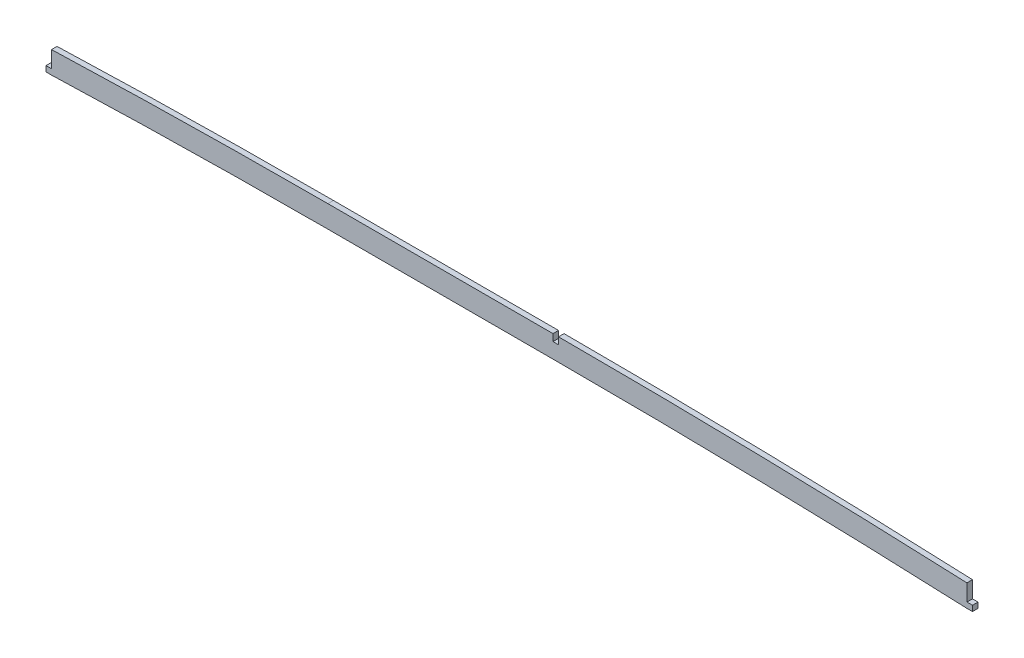
ISO-10303-21;
HEADER;
FILE_DESCRIPTION(('STEP AP214'),'2;1');
FILE_NAME('part.step','',(''),(''),'','','');
FILE_SCHEMA(('AUTOMOTIVE_DESIGN { 1 0 10303 214 1 1 1 1 }'));
ENDSEC;
DATA;
#1=APPLICATION_CONTEXT('core data for automotive mechanical design processes');
#2=APPLICATION_PROTOCOL_DEFINITION('international standard','automotive_design',2000,#1);
#3=PRODUCT_CONTEXT('',#1,'mechanical');
#4=PRODUCT('Part','Part','',(#3));
#5=PRODUCT_RELATED_PRODUCT_CATEGORY('part','',(#4));
#6=PRODUCT_DEFINITION_FORMATION('','',#4);
#7=PRODUCT_DEFINITION_CONTEXT('part definition',#1,'design');
#8=PRODUCT_DEFINITION('design','',#6,#7);
#9=PRODUCT_DEFINITION_SHAPE('','',#8);
#10=(LENGTH_UNIT() NAMED_UNIT(*) SI_UNIT(.MILLI.,.METRE.));
#11=(NAMED_UNIT(*) PLANE_ANGLE_UNIT() SI_UNIT($,.RADIAN.));
#12=(NAMED_UNIT(*) SI_UNIT($,.STERADIAN.) SOLID_ANGLE_UNIT());
#13=UNCERTAINTY_MEASURE_WITH_UNIT(LENGTH_MEASURE(1.E-05),#10,'distance_accuracy_value','');
#14=(GEOMETRIC_REPRESENTATION_CONTEXT(3) GLOBAL_UNCERTAINTY_ASSIGNED_CONTEXT((#13)) GLOBAL_UNIT_ASSIGNED_CONTEXT((#10,
#11,#12)) REPRESENTATION_CONTEXT('',''));
#15=CARTESIAN_POINT('',(0.,0.,0.));
#16=DIRECTION('',(0.,0.,1.));
#17=DIRECTION('',(1.,0.,0.));
#18=AXIS2_PLACEMENT_3D('',#15,#16,#17);
#19=CARTESIAN_POINT('',(-477.499999999999,-14124.5746921934,10.));
#20=DIRECTION('',(0.,0.,-1.));
#21=DIRECTION('',(-1.,0.,0.));
#22=AXIS2_PLACEMENT_3D('',#19,#20,#21);
#23=CYLINDRICAL_SURFACE('',#22,14466.0488219718);
#24=CARTESIAN_POINT('',(-477.499999999999,-14124.5746921934,0.));
#25=DIRECTION('',(0.,0.,1.));
#26=DIRECTION('',(1.,0.,0.));
#27=AXIS2_PLACEMENT_3D('',#24,#25,#26);
#28=CIRCLE('',#27,14466.0488219718);
#29=CARTESIAN_POINT('',(-477.500000000001,341.474129778411,0.));
#30=VERTEX_POINT('',#29);
#31=CARTESIAN_POINT('',(-977.499999999922,332.83062548626,0.));
#32=VERTEX_POINT('',#31);
#33=EDGE_CURVE('E197',#30,#32,#28,.T.);
#34=ORIENTED_EDGE('',*,*,#33,.F.);
#35=DIRECTION('',(0.,0.,-1.));
#36=VECTOR('',#35,1.);
#37=CARTESIAN_POINT('',(-477.500000000001,341.474129778411,10.));
#38=LINE('',#37,#36);
#39=CARTESIAN_POINT('',(-477.500000000001,341.474129778411,10.));
#40=VERTEX_POINT('',#39);
#41=EDGE_CURVE('E11',#40,#30,#38,.T.);
#42=ORIENTED_EDGE('',*,*,#41,.F.);
#43=CARTESIAN_POINT('',(-477.499999999999,-14124.5746921934,10.));
#44=DIRECTION('',(0.,0.,1.));
#45=DIRECTION('',(1.,0.,0.));
#46=AXIS2_PLACEMENT_3D('',#43,#44,#45);
#47=CIRCLE('',#46,14466.0488219718);
#48=CARTESIAN_POINT('',(-977.499999999922,332.83062548626,10.));
#49=VERTEX_POINT('',#48);
#50=EDGE_CURVE('E255',#40,#49,#47,.T.);
#51=ORIENTED_EDGE('',*,*,#50,.T.);
#52=DIRECTION('',(0.,0.,-1.));
#53=VECTOR('',#52,1.);
#54=CARTESIAN_POINT('',(-977.499999999922,332.83062548626,10.));
#55=LINE('',#54,#53);
#56=EDGE_CURVE('E62',#49,#32,#55,.T.);
#57=ORIENTED_EDGE('',*,*,#56,.T.);
#58=EDGE_LOOP('',(#34,#42,#51,#57));
#59=FACE_BOUND('',#58,.T.);
#60=ADVANCED_FACE('F45',(#59),#23,.F.);
#61=CARTESIAN_POINT('',(-6.81319186965665E-13,341.474129778412,10.));
#62=DIRECTION('',(0.,1.,0.));
#63=DIRECTION('',(-1.,0.,0.));
#64=AXIS2_PLACEMENT_3D('',#61,#62,#63);
#65=PLANE('',#64);
#66=DIRECTION('',(1.,0.,0.));
#67=VECTOR('',#66,1.);
#68=CARTESIAN_POINT('',(-6.81319186965665E-13,341.474129778412,0.));
#69=LINE('',#68,#67);
#70=CARTESIAN_POINT('',(-60.1708885717872,341.474129778412,0.));
#71=VERTEX_POINT('',#70);
#72=EDGE_CURVE('E200',#30,#71,#69,.T.);
#73=ORIENTED_EDGE('',*,*,#72,.T.);
#74=DIRECTION('',(0.,0.,-1.));
#75=VECTOR('',#74,1.);
#76=CARTESIAN_POINT('',(-60.1708885717872,341.474129778412,10.));
#77=LINE('',#76,#75);
#78=CARTESIAN_POINT('',(-60.1708885717872,341.474129778412,10.));
#79=VERTEX_POINT('',#78);
#80=EDGE_CURVE('E54',#79,#71,#77,.T.);
#81=ORIENTED_EDGE('',*,*,#80,.F.);
#82=DIRECTION('',(1.,0.,0.));
#83=VECTOR('',#82,1.);
#84=CARTESIAN_POINT('',(-6.81319186965665E-13,341.474129778412,10.));
#85=LINE('',#84,#83);
#86=EDGE_CURVE('E607',#40,#79,#85,.T.);
#87=ORIENTED_EDGE('',*,*,#86,.F.);
#88=ORIENTED_EDGE('',*,*,#41,.T.);
#89=EDGE_LOOP('',(#73,#81,#87,#88));
#90=FACE_BOUND('',#89,.T.);
#91=ADVANCED_FACE('F310',(#90),#65,.F.);
#92=CARTESIAN_POINT('',(-60.1708885717883,-16621.7092035549,10.));
#93=DIRECTION('',(0.,0.,-1.));
#94=DIRECTION('',(-1.,0.,0.));
#95=AXIS2_PLACEMENT_3D('',#92,#93,#94);
#96=CYLINDRICAL_SURFACE('',#95,16963.1833333333);
#97=CARTESIAN_POINT('',(-60.1708885717883,-16621.7092035549,0.));
#98=DIRECTION('',(0.,0.,1.));
#99=DIRECTION('',(1.,0.,0.));
#100=AXIS2_PLACEMENT_3D('',#97,#98,#99);
#101=CIRCLE('',#100,16963.1833333333);
#102=CARTESIAN_POINT('',(678.758400695459,325.37232412237,0.));
#103=VERTEX_POINT('',#102);
#104=EDGE_CURVE('E204',#103,#71,#101,.T.);
#105=ORIENTED_EDGE('',*,*,#104,.F.);
#106=DIRECTION('',(0.,0.,-1.));
#107=VECTOR('',#106,1.);
#108=CARTESIAN_POINT('',(678.758400695459,325.37232412237,10.));
#109=LINE('',#108,#107);
#110=CARTESIAN_POINT('',(678.758400695459,325.37232412237,10.));
#111=VERTEX_POINT('',#110);
#112=EDGE_CURVE('E298',#111,#103,#109,.T.);
#113=ORIENTED_EDGE('',*,*,#112,.F.);
#114=CARTESIAN_POINT('',(-60.1708885717883,-16621.7092035549,10.));
#115=DIRECTION('',(0.,0.,1.));
#116=DIRECTION('',(1.,0.,0.));
#117=AXIS2_PLACEMENT_3D('',#114,#115,#116);
#118=CIRCLE('',#117,16963.1833333333);
#119=EDGE_CURVE('E307',#111,#79,#118,.T.);
#120=ORIENTED_EDGE('',*,*,#119,.T.);
#121=ORIENTED_EDGE('',*,*,#80,.T.);
#122=EDGE_LOOP('',(#105,#113,#120,#121));
#123=FACE_BOUND('',#122,.T.);
#124=ADVANCED_FACE('F305',(#123),#96,.F.);
#125=CARTESIAN_POINT('',(-2.31190941323006E-10,325.372324121884,10.));
#126=DIRECTION('',(-7.10542735762624E-13,1.,0.));
#127=DIRECTION('',(-1.,-7.10542735762624E-13,0.));
#128=AXIS2_PLACEMENT_3D('',#125,#126,#127);
#129=PLANE('',#128);
#130=DIRECTION('',(1.,7.10542735762624E-13,0.));
#131=VECTOR('',#130,1.);
#132=CARTESIAN_POINT('',(-2.31190941323006E-10,325.372324121884,0.));
#133=LINE('',#132,#131);
#134=CARTESIAN_POINT('',(688.758400695423,325.372324122373,0.));
#135=VERTEX_POINT('',#134);
#136=EDGE_CURVE('E208',#103,#135,#133,.T.);
#137=ORIENTED_EDGE('',*,*,#136,.T.);
#138=DIRECTION('',(0.,0.,-1.));
#139=VECTOR('',#138,1.);
#140=CARTESIAN_POINT('',(688.758400695423,325.372324122373,10.));
#141=LINE('',#140,#139);
#142=CARTESIAN_POINT('',(688.758400695423,325.372324122373,10.));
#143=VERTEX_POINT('',#142);
#144=EDGE_CURVE('E294',#143,#135,#141,.T.);
#145=ORIENTED_EDGE('',*,*,#144,.F.);
#146=DIRECTION('',(1.,7.10542735762624E-13,0.));
#147=VECTOR('',#146,1.);
#148=CARTESIAN_POINT('',(-2.31190941323006E-10,325.372324121884,10.));
#149=LINE('',#148,#147);
#150=EDGE_CURVE('E328',#111,#143,#149,.T.);
#151=ORIENTED_EDGE('',*,*,#150,.F.);
#152=ORIENTED_EDGE('',*,*,#112,.T.);
#153=EDGE_LOOP('',(#137,#145,#151,#152));
#154=FACE_BOUND('',#153,.T.);
#155=ADVANCED_FACE('F318',(#154),#129,.F.);
#156=CARTESIAN_POINT('',(688.758400695423,0.,10.));
#157=DIRECTION('',(-1.,0.,0.));
#158=DIRECTION('',(0.,0.,1.));
#159=AXIS2_PLACEMENT_3D('',#156,#157,#158);
#160=PLANE('',#159);
#161=DIRECTION('',(0.,1.,0.));
#162=VECTOR('',#161,1.);
#163=CARTESIAN_POINT('',(688.758400695423,0.,0.));
#164=LINE('',#163,#162);
#165=CARTESIAN_POINT('',(688.758400695423,335.372324122373,0.));
#166=VERTEX_POINT('',#165);
#167=EDGE_CURVE('E211',#135,#166,#164,.T.);
#168=ORIENTED_EDGE('',*,*,#167,.T.);
#169=DIRECTION('',(0.,0.,-1.));
#170=VECTOR('',#169,1.);
#171=CARTESIAN_POINT('',(688.758400695423,335.372324122373,10.));
#172=LINE('',#171,#170);
#173=CARTESIAN_POINT('',(688.758400695423,335.372324122373,10.));
#174=VERTEX_POINT('',#173);
#175=EDGE_CURVE('E290',#174,#166,#172,.T.);
#176=ORIENTED_EDGE('',*,*,#175,.F.);
#177=DIRECTION('',(0.,1.,0.));
#178=VECTOR('',#177,1.);
#179=CARTESIAN_POINT('',(688.758400695423,0.,10.));
#180=LINE('',#179,#178);
#181=EDGE_CURVE('E324',#143,#174,#180,.T.);
#182=ORIENTED_EDGE('',*,*,#181,.F.);
#183=ORIENTED_EDGE('',*,*,#144,.T.);
#184=EDGE_LOOP('',(#168,#176,#182,#183));
#185=FACE_BOUND('',#184,.T.);
#186=ADVANCED_FACE('F322',(#185),#160,.F.);
#187=CARTESIAN_POINT('',(0.,335.372324122373,10.));
#188=DIRECTION('',(0.,-1.,0.));
#189=DIRECTION('',(0.,0.,-1.));
#190=AXIS2_PLACEMENT_3D('',#187,#188,#189);
#191=PLANE('',#190);
#192=DIRECTION('',(-1.,0.,0.));
#193=VECTOR('',#192,1.);
#194=CARTESIAN_POINT('',(0.,335.372324122373,0.));
#195=LINE('',#194,#193);
#196=CARTESIAN_POINT('',(678.758400695459,335.372324122373,0.));
#197=VERTEX_POINT('',#196);
#198=EDGE_CURVE('E214',#166,#197,#195,.T.);
#199=ORIENTED_EDGE('',*,*,#198,.T.);
#200=DIRECTION('',(0.,0.,-1.));
#201=VECTOR('',#200,1.);
#202=CARTESIAN_POINT('',(678.758400695459,335.372324122373,10.));
#203=LINE('',#202,#201);
#204=CARTESIAN_POINT('',(678.758400695459,335.372324122373,10.));
#205=VERTEX_POINT('',#204);
#206=EDGE_CURVE('E287',#205,#197,#203,.T.);
#207=ORIENTED_EDGE('',*,*,#206,.F.);
#208=DIRECTION('',(-1.,0.,0.));
#209=VECTOR('',#208,1.);
#210=CARTESIAN_POINT('',(0.,335.372324122373,10.));
#211=LINE('',#210,#209);
#212=EDGE_CURVE('E327',#174,#205,#211,.T.);
#213=ORIENTED_EDGE('',*,*,#212,.F.);
#214=ORIENTED_EDGE('',*,*,#175,.T.);
#215=EDGE_LOOP('',(#199,#207,#213,#214));
#216=FACE_BOUND('',#215,.T.);
#217=ADVANCED_FACE('F391',(#216),#191,.F.);
#218=CARTESIAN_POINT('',(678.758400695459,0.,10.));
#219=DIRECTION('',(1.,0.,0.));
#220=DIRECTION('',(0.,0.,-1.));
#221=AXIS2_PLACEMENT_3D('',#218,#219,#220);
#222=PLANE('',#221);
#223=DIRECTION('',(0.,-1.,0.));
#224=VECTOR('',#223,1.);
#225=CARTESIAN_POINT('',(678.758400695459,0.,0.));
#226=LINE('',#225,#224);
#227=CARTESIAN_POINT('',(678.758400695459,365.410239493908,0.));
#228=VERTEX_POINT('',#227);
#229=EDGE_CURVE('E218',#228,#197,#226,.T.);
#230=ORIENTED_EDGE('',*,*,#229,.F.);
#231=DIRECTION('',(0.,0.,-1.));
#232=VECTOR('',#231,1.);
#233=CARTESIAN_POINT('',(678.758400695459,365.410239493908,10.));
#234=LINE('',#233,#232);
#235=CARTESIAN_POINT('',(678.758400695459,365.410239493908,10.));
#236=VERTEX_POINT('',#235);
#237=EDGE_CURVE('E284',#236,#228,#234,.T.);
#238=ORIENTED_EDGE('',*,*,#237,.F.);
#239=DIRECTION('',(0.,-1.,0.));
#240=VECTOR('',#239,1.);
#241=CARTESIAN_POINT('',(678.758400695459,0.,10.));
#242=LINE('',#241,#240);
#243=EDGE_CURVE('E332',#236,#205,#242,.T.);
#244=ORIENTED_EDGE('',*,*,#243,.T.);
#245=ORIENTED_EDGE('',*,*,#206,.T.);
#246=EDGE_LOOP('',(#230,#238,#244,#245));
#247=FACE_BOUND('',#246,.T.);
#248=ADVANCED_FACE('F394',(#247),#222,.T.);
#249=CARTESIAN_POINT('',(-60.1708885717883,-16621.7092035549,10.));
#250=DIRECTION('',(0.,0.,-1.));
#251=DIRECTION('',(-1.,0.,0.));
#252=AXIS2_PLACEMENT_3D('',#249,#250,#251);
#253=CYLINDRICAL_SURFACE('',#252,17003.1833333333);
#254=CARTESIAN_POINT('',(-60.1708885717883,-16621.7092035549,0.));
#255=DIRECTION('',(0.,0.,1.));
#256=DIRECTION('',(1.,0.,0.));
#257=AXIS2_PLACEMENT_3D('',#254,#255,#256);
#258=CIRCLE('',#257,17003.1833333333);
#259=CARTESIAN_POINT('',(-60.1708885717883,381.474129778411,0.));
#260=VERTEX_POINT('',#259);
#261=EDGE_CURVE('E222',#228,#260,#258,.T.);
#262=ORIENTED_EDGE('',*,*,#261,.T.);
#263=DIRECTION('',(0.,0.,-1.));
#264=VECTOR('',#263,1.);
#265=CARTESIAN_POINT('',(-60.1708885717883,381.474129778411,10.));
#266=LINE('',#265,#264);
#267=CARTESIAN_POINT('',(-60.1708885717883,381.474129778411,10.));
#268=VERTEX_POINT('',#267);
#269=EDGE_CURVE('E280',#268,#260,#266,.T.);
#270=ORIENTED_EDGE('',*,*,#269,.F.);
#271=CARTESIAN_POINT('',(-60.1708885717883,-16621.7092035549,10.));
#272=DIRECTION('',(0.,0.,1.));
#273=DIRECTION('',(1.,0.,0.));
#274=AXIS2_PLACEMENT_3D('',#271,#272,#273);
#275=CIRCLE('',#274,17003.1833333333);
#276=EDGE_CURVE('E340',#236,#268,#275,.T.);
#277=ORIENTED_EDGE('',*,*,#276,.F.);
#278=ORIENTED_EDGE('',*,*,#237,.T.);
#279=EDGE_LOOP('',(#262,#270,#277,#278));
#280=FACE_BOUND('',#279,.T.);
#281=ADVANCED_FACE('F398',(#280),#253,.T.);
#282=CARTESIAN_POINT('',(-60.170888571851,9.88685967388429E-12,10.));
#283=DIRECTION('',(1.,-1.64313007644523E-13,0.));
#284=DIRECTION('',(1.64313007644523E-13,1.,0.));
#285=AXIS2_PLACEMENT_3D('',#282,#283,#284);
#286=PLANE('',#285);
#287=DIRECTION('',(-1.64313007644523E-13,-1.,0.));
#288=VECTOR('',#287,1.);
#289=CARTESIAN_POINT('',(-60.170888571851,9.88685967388429E-12,0.));
#290=LINE('',#289,#288);
#291=CARTESIAN_POINT('',(-60.1708885717904,368.974129778411,0.));
#292=VERTEX_POINT('',#291);
#293=EDGE_CURVE('E225',#260,#292,#290,.T.);
#294=ORIENTED_EDGE('',*,*,#293,.T.);
#295=DIRECTION('',(0.,0.,-1.));
#296=VECTOR('',#295,1.);
#297=CARTESIAN_POINT('',(-60.1708885717904,368.974129778411,10.));
#298=LINE('',#297,#296);
#299=CARTESIAN_POINT('',(-60.1708885717904,368.974129778411,10.));
#300=VERTEX_POINT('',#299);
#301=EDGE_CURVE('E276',#300,#292,#298,.T.);
#302=ORIENTED_EDGE('',*,*,#301,.F.);
#303=DIRECTION('',(-1.64313007644523E-13,-1.,0.));
#304=VECTOR('',#303,1.);
#305=CARTESIAN_POINT('',(-60.170888571851,9.88685967388429E-12,10.));
#306=LINE('',#305,#304);
#307=EDGE_CURVE('E343',#268,#300,#306,.T.);
#308=ORIENTED_EDGE('',*,*,#307,.F.);
#309=ORIENTED_EDGE('',*,*,#269,.T.);
#310=EDGE_LOOP('',(#294,#302,#308,#309));
#311=FACE_BOUND('',#310,.T.);
#312=ADVANCED_FACE('F402',(#311),#286,.F.);
#313=CARTESIAN_POINT('',(0.,368.974129778411,10.));
#314=DIRECTION('',(0.,-1.,0.));
#315=DIRECTION('',(0.,0.,-1.));
#316=AXIS2_PLACEMENT_3D('',#313,#314,#315);
#317=PLANE('',#316);
#318=DIRECTION('',(-1.,0.,0.));
#319=VECTOR('',#318,1.);
#320=CARTESIAN_POINT('',(0.,368.974129778411,0.));
#321=LINE('',#320,#319);
#322=CARTESIAN_POINT('',(-70.1708885717904,368.974129778411,0.));
#323=VERTEX_POINT('',#322);
#324=EDGE_CURVE('E228',#292,#323,#321,.T.);
#325=ORIENTED_EDGE('',*,*,#324,.T.);
#326=DIRECTION('',(0.,0.,-1.));
#327=VECTOR('',#326,1.);
#328=CARTESIAN_POINT('',(-70.1708885717904,368.974129778411,10.));
#329=LINE('',#328,#327);
#330=CARTESIAN_POINT('',(-70.1708885717904,368.974129778411,10.));
#331=VERTEX_POINT('',#330);
#332=EDGE_CURVE('E272',#331,#323,#329,.T.);
#333=ORIENTED_EDGE('',*,*,#332,.F.);
#334=DIRECTION('',(-1.,0.,0.));
#335=VECTOR('',#334,1.);
#336=CARTESIAN_POINT('',(0.,368.974129778411,10.));
#337=LINE('',#336,#335);
#338=EDGE_CURVE('E346',#300,#331,#337,.T.);
#339=ORIENTED_EDGE('',*,*,#338,.F.);
#340=ORIENTED_EDGE('',*,*,#301,.T.);
#341=EDGE_LOOP('',(#325,#333,#339,#340));
#342=FACE_BOUND('',#341,.T.);
#343=ADVANCED_FACE('F406',(#342),#317,.F.);
#344=CARTESIAN_POINT('',(-70.170888571792,3.11621344603239E-13,10.));
#345=DIRECTION('',(-1.,0.,0.));
#346=DIRECTION('',(0.,-1.,0.));
#347=AXIS2_PLACEMENT_3D('',#344,#345,#346);
#348=PLANE('',#347);
#349=DIRECTION('',(0.,1.,0.));
#350=VECTOR('',#349,1.);
#351=CARTESIAN_POINT('',(-70.170888571792,3.11621344603239E-13,0.));
#352=LINE('',#351,#350);
#353=CARTESIAN_POINT('',(-70.1708885717903,381.474129778411,0.));
#354=VERTEX_POINT('',#353);
#355=EDGE_CURVE('E231',#323,#354,#352,.T.);
#356=ORIENTED_EDGE('',*,*,#355,.T.);
#357=DIRECTION('',(0.,0.,-1.));
#358=VECTOR('',#357,1.);
#359=CARTESIAN_POINT('',(-70.1708885717903,381.474129778411,10.));
#360=LINE('',#359,#358);
#361=CARTESIAN_POINT('',(-70.1708885717903,381.474129778411,10.));
#362=VERTEX_POINT('',#361);
#363=EDGE_CURVE('E269',#362,#354,#360,.T.);
#364=ORIENTED_EDGE('',*,*,#363,.F.);
#365=DIRECTION('',(0.,1.,0.));
#366=VECTOR('',#365,1.);
#367=CARTESIAN_POINT('',(-70.170888571792,3.11621344603239E-13,10.));
#368=LINE('',#367,#366);
#369=EDGE_CURVE('E349',#331,#362,#368,.T.);
#370=ORIENTED_EDGE('',*,*,#369,.F.);
#371=ORIENTED_EDGE('',*,*,#332,.T.);
#372=EDGE_LOOP('',(#356,#364,#370,#371));
#373=FACE_BOUND('',#372,.T.);
#374=ADVANCED_FACE('F410',(#373),#348,.F.);
#375=CARTESIAN_POINT('',(0.,381.474129778411,10.));
#376=DIRECTION('',(0.,1.,0.));
#377=DIRECTION('',(0.,0.,1.));
#378=AXIS2_PLACEMENT_3D('',#375,#376,#377);
#379=PLANE('',#378);
#380=DIRECTION('',(1.,0.,0.));
#381=VECTOR('',#380,1.);
#382=CARTESIAN_POINT('',(0.,381.474129778411,0.));
#383=LINE('',#382,#381);
#384=CARTESIAN_POINT('',(-477.500000000001,381.474129778411,0.));
#385=VERTEX_POINT('',#384);
#386=EDGE_CURVE('E235',#385,#354,#383,.T.);
#387=ORIENTED_EDGE('',*,*,#386,.F.);
#388=DIRECTION('',(0.,0.,-1.));
#389=VECTOR('',#388,1.);
#390=CARTESIAN_POINT('',(-477.500000000001,381.474129778411,10.));
#391=LINE('',#390,#389);
#392=CARTESIAN_POINT('',(-477.500000000001,381.474129778411,10.));
#393=VERTEX_POINT('',#392);
#394=EDGE_CURVE('E266',#393,#385,#391,.T.);
#395=ORIENTED_EDGE('',*,*,#394,.F.);
#396=DIRECTION('',(1.,0.,0.));
#397=VECTOR('',#396,1.);
#398=CARTESIAN_POINT('',(0.,381.474129778411,10.));
#399=LINE('',#398,#397);
#400=EDGE_CURVE('E352',#393,#362,#399,.T.);
#401=ORIENTED_EDGE('',*,*,#400,.T.);
#402=ORIENTED_EDGE('',*,*,#363,.T.);
#403=EDGE_LOOP('',(#387,#395,#401,#402));
#404=FACE_BOUND('',#403,.T.);
#405=ADVANCED_FACE('F414',(#404),#379,.T.);
#406=CARTESIAN_POINT('',(-477.499999999999,-14124.5746921934,10.));
#407=DIRECTION('',(0.,0.,-1.));
#408=DIRECTION('',(-1.,0.,0.));
#409=AXIS2_PLACEMENT_3D('',#406,#407,#408);
#410=CYLINDRICAL_SURFACE('',#409,14506.0488219718);
#411=CARTESIAN_POINT('',(-477.499999999999,-14124.5746921934,0.));
#412=DIRECTION('',(0.,0.,1.));
#413=DIRECTION('',(1.,0.,0.));
#414=AXIS2_PLACEMENT_3D('',#411,#412,#413);
#415=CIRCLE('',#414,14506.0488219718);
#416=CARTESIAN_POINT('',(-977.499999999922,372.854473883933,0.));
#417=VERTEX_POINT('',#416);
#418=EDGE_CURVE('E239',#385,#417,#415,.T.);
#419=ORIENTED_EDGE('',*,*,#418,.T.);
#420=DIRECTION('',(0.,0.,-1.));
#421=VECTOR('',#420,1.);
#422=CARTESIAN_POINT('',(-977.499999999922,372.854473883933,10.));
#423=LINE('',#422,#421);
#424=CARTESIAN_POINT('',(-977.499999999922,372.854473883933,10.));
#425=VERTEX_POINT('',#424);
#426=EDGE_CURVE('E262',#425,#417,#423,.T.);
#427=ORIENTED_EDGE('',*,*,#426,.F.);
#428=CARTESIAN_POINT('',(-477.499999999999,-14124.5746921934,10.));
#429=DIRECTION('',(0.,0.,1.));
#430=DIRECTION('',(1.,0.,0.));
#431=AXIS2_PLACEMENT_3D('',#428,#429,#430);
#432=CIRCLE('',#431,14506.0488219718);
#433=EDGE_CURVE('E356',#393,#425,#432,.T.);
#434=ORIENTED_EDGE('',*,*,#433,.F.);
#435=ORIENTED_EDGE('',*,*,#394,.T.);
#436=EDGE_LOOP('',(#419,#427,#434,#435));
#437=FACE_BOUND('',#436,.T.);
#438=ADVANCED_FACE('F363',(#437),#410,.T.);
#439=CARTESIAN_POINT('',(-977.499999999922,3.24448351589489E-13,10.));
#440=DIRECTION('',(1.,0.,0.));
#441=DIRECTION('',(0.,1.,0.));
#442=AXIS2_PLACEMENT_3D('',#439,#440,#441);
#443=PLANE('',#442);
#444=DIRECTION('',(0.,-1.,0.));
#445=VECTOR('',#444,1.);
#446=CARTESIAN_POINT('',(-977.499999999922,3.24448351589489E-13,0.));
#447=LINE('',#446,#445);
#448=CARTESIAN_POINT('',(-977.499999999922,342.830625486258,0.));
#449=VERTEX_POINT('',#448);
#450=EDGE_CURVE('E242',#417,#449,#447,.T.);
#451=ORIENTED_EDGE('',*,*,#450,.T.);
#452=DIRECTION('',(0.,0.,-1.));
#453=VECTOR('',#452,1.);
#454=CARTESIAN_POINT('',(-977.499999999922,342.830625486258,10.));
#455=LINE('',#454,#453);
#456=CARTESIAN_POINT('',(-977.499999999922,342.830625486258,10.));
#457=VERTEX_POINT('',#456);
#458=EDGE_CURVE('E176',#457,#449,#455,.T.);
#459=ORIENTED_EDGE('',*,*,#458,.F.);
#460=DIRECTION('',(0.,-1.,0.));
#461=VECTOR('',#460,1.);
#462=CARTESIAN_POINT('',(-977.499999999922,3.24448351589489E-13,10.));
#463=LINE('',#462,#461);
#464=EDGE_CURVE('E185',#425,#457,#463,.T.);
#465=ORIENTED_EDGE('',*,*,#464,.F.);
#466=ORIENTED_EDGE('',*,*,#426,.T.);
#467=EDGE_LOOP('',(#451,#459,#465,#466));
#468=FACE_BOUND('',#467,.T.);
#469=ADVANCED_FACE('F367',(#468),#443,.F.);
#470=CARTESIAN_POINT('',(0.,342.830625486258,10.));
#471=DIRECTION('',(0.,1.,0.));
#472=DIRECTION('',(0.,0.,1.));
#473=AXIS2_PLACEMENT_3D('',#470,#471,#472);
#474=PLANE('',#473);
#475=DIRECTION('',(1.,0.,0.));
#476=VECTOR('',#475,1.);
#477=CARTESIAN_POINT('',(0.,342.830625486258,0.));
#478=LINE('',#477,#476);
#479=CARTESIAN_POINT('',(-987.499999999922,342.830625486258,0.));
#480=VERTEX_POINT('',#479);
#481=EDGE_CURVE('E171',#480,#449,#478,.T.);
#482=ORIENTED_EDGE('',*,*,#481,.F.);
#483=DIRECTION('',(0.,0.,-1.));
#484=VECTOR('',#483,1.);
#485=CARTESIAN_POINT('',(-987.499999999922,342.830625486258,10.));
#486=LINE('',#485,#484);
#487=CARTESIAN_POINT('',(-987.499999999922,342.830625486258,10.));
#488=VERTEX_POINT('',#487);
#489=EDGE_CURVE('E166',#488,#480,#486,.T.);
#490=ORIENTED_EDGE('',*,*,#489,.F.);
#491=DIRECTION('',(1.,0.,0.));
#492=VECTOR('',#491,1.);
#493=CARTESIAN_POINT('',(0.,342.830625486258,10.));
#494=LINE('',#493,#492);
#495=EDGE_CURVE('E169',#488,#457,#494,.T.);
#496=ORIENTED_EDGE('',*,*,#495,.T.);
#497=ORIENTED_EDGE('',*,*,#458,.T.);
#498=EDGE_LOOP('',(#482,#490,#496,#497));
#499=FACE_BOUND('',#498,.T.);
#500=ADVANCED_FACE('F168',(#499),#474,.T.);
#501=CARTESIAN_POINT('',(-987.499999999922,0.,10.));
#502=DIRECTION('',(-1.,0.,0.));
#503=DIRECTION('',(0.,0.,1.));
#504=AXIS2_PLACEMENT_3D('',#501,#502,#503);
#505=PLANE('',#504);
#506=DIRECTION('',(0.,1.,0.));
#507=VECTOR('',#506,1.);
#508=CARTESIAN_POINT('',(-987.499999999922,0.,0.));
#509=LINE('',#508,#507);
#510=CARTESIAN_POINT('',(-987.499999999922,332.830625486258,0.));
#511=VERTEX_POINT('',#510);
#512=EDGE_CURVE('E248',#511,#480,#509,.T.);
#513=ORIENTED_EDGE('',*,*,#512,.F.);
#514=DIRECTION('',(0.,0.,-1.));
#515=VECTOR('',#514,1.);
#516=CARTESIAN_POINT('',(-987.499999999922,332.830625486258,10.));
#517=LINE('',#516,#515);
#518=CARTESIAN_POINT('',(-987.499999999922,332.830625486258,10.));
#519=VERTEX_POINT('',#518);
#520=EDGE_CURVE('E114',#519,#511,#517,.T.);
#521=ORIENTED_EDGE('',*,*,#520,.F.);
#522=DIRECTION('',(0.,1.,0.));
#523=VECTOR('',#522,1.);
#524=CARTESIAN_POINT('',(-987.499999999922,0.,10.));
#525=LINE('',#524,#523);
#526=EDGE_CURVE('E183',#519,#488,#525,.T.);
#527=ORIENTED_EDGE('',*,*,#526,.T.);
#528=ORIENTED_EDGE('',*,*,#489,.T.);
#529=EDGE_LOOP('',(#513,#521,#527,#528));
#530=FACE_BOUND('',#529,.T.);
#531=ADVANCED_FACE('F189',(#530),#505,.T.);
#532=CARTESIAN_POINT('',(-5.91225957944689E-11,332.830625486433,10.));
#533=DIRECTION('',(1.77635683940025E-13,-1.,0.));
#534=DIRECTION('',(1.,1.77635683940025E-13,0.));
#535=AXIS2_PLACEMENT_3D('',#532,#533,#534);
#536=PLANE('',#535);
#537=DIRECTION('',(-1.,-1.77635683940025E-13,0.));
#538=VECTOR('',#537,1.);
#539=CARTESIAN_POINT('',(-5.91225957944689E-11,332.830625486433,0.));
#540=LINE('',#539,#538);
#541=EDGE_CURVE('E251',#32,#511,#540,.T.);
#542=ORIENTED_EDGE('',*,*,#541,.F.);
#543=ORIENTED_EDGE('',*,*,#56,.F.);
#544=DIRECTION('',(-1.,-1.77635683940025E-13,0.));
#545=VECTOR('',#544,1.);
#546=CARTESIAN_POINT('',(-5.91225957944689E-11,332.830625486433,10.));
#547=LINE('',#546,#545);
#548=EDGE_CURVE('E191',#49,#519,#547,.T.);
#549=ORIENTED_EDGE('',*,*,#548,.T.);
#550=ORIENTED_EDGE('',*,*,#520,.T.);
#551=EDGE_LOOP('',(#542,#543,#549,#550));
#552=FACE_BOUND('',#551,.T.);
#553=ADVANCED_FACE('F368',(#552),#536,.T.);
#554=CARTESIAN_POINT('',(0.,0.,10.));
#555=DIRECTION('',(0.,0.,1.));
#556=DIRECTION('',(1.,0.,0.));
#557=AXIS2_PLACEMENT_3D('',#554,#555,#556);
#558=PLANE('',#557);
#559=ORIENTED_EDGE('',*,*,#50,.F.);
#560=ORIENTED_EDGE('',*,*,#86,.T.);
#561=ORIENTED_EDGE('',*,*,#119,.F.);
#562=ORIENTED_EDGE('',*,*,#150,.T.);
#563=ORIENTED_EDGE('',*,*,#181,.T.);
#564=ORIENTED_EDGE('',*,*,#212,.T.);
#565=ORIENTED_EDGE('',*,*,#243,.F.);
#566=ORIENTED_EDGE('',*,*,#276,.T.);
#567=ORIENTED_EDGE('',*,*,#307,.T.);
#568=ORIENTED_EDGE('',*,*,#338,.T.);
#569=ORIENTED_EDGE('',*,*,#369,.T.);
#570=ORIENTED_EDGE('',*,*,#400,.F.);
#571=ORIENTED_EDGE('',*,*,#433,.T.);
#572=ORIENTED_EDGE('',*,*,#464,.T.);
#573=ORIENTED_EDGE('',*,*,#495,.F.);
#574=ORIENTED_EDGE('',*,*,#526,.F.);
#575=ORIENTED_EDGE('',*,*,#548,.F.);
#576=EDGE_LOOP('',(#559,#560,#561,#562,#563,#564,#565,#566,#567,#568,#569,#570,#571,#572,#573,
#574,#575));
#577=FACE_BOUND('',#576,.T.);
#578=ADVANCED_FACE('F181',(#577),#558,.T.);
#579=CARTESIAN_POINT('',(0.,0.,0.));
#580=DIRECTION('',(0.,0.,1.));
#581=DIRECTION('',(1.,0.,0.));
#582=AXIS2_PLACEMENT_3D('',#579,#580,#581);
#583=PLANE('',#582);
#584=ORIENTED_EDGE('',*,*,#33,.T.);
#585=ORIENTED_EDGE('',*,*,#541,.T.);
#586=ORIENTED_EDGE('',*,*,#512,.T.);
#587=ORIENTED_EDGE('',*,*,#481,.T.);
#588=ORIENTED_EDGE('',*,*,#450,.F.);
#589=ORIENTED_EDGE('',*,*,#418,.F.);
#590=ORIENTED_EDGE('',*,*,#386,.T.);
#591=ORIENTED_EDGE('',*,*,#355,.F.);
#592=ORIENTED_EDGE('',*,*,#324,.F.);
#593=ORIENTED_EDGE('',*,*,#293,.F.);
#594=ORIENTED_EDGE('',*,*,#261,.F.);
#595=ORIENTED_EDGE('',*,*,#229,.T.);
#596=ORIENTED_EDGE('',*,*,#198,.F.);
#597=ORIENTED_EDGE('',*,*,#167,.F.);
#598=ORIENTED_EDGE('',*,*,#136,.F.);
#599=ORIENTED_EDGE('',*,*,#104,.T.);
#600=ORIENTED_EDGE('',*,*,#72,.F.);
#601=EDGE_LOOP('',(#584,#585,#586,#587,#588,#589,#590,#591,#592,#593,#594,#595,#596,#597,#598,
#599,#600));
#602=FACE_BOUND('',#601,.T.);
#603=ADVANCED_FACE('F313',(#602),#583,.F.);
#604=CLOSED_SHELL('',(#60,#91,#124,#155,#186,#217,#248,#281,#312,#343,#374,#405,#438,#469,#500,
#531,#553,#578,#603));
#605=MANIFOLD_SOLID_BREP('B2',#604);
#606=ADVANCED_BREP_SHAPE_REPRESENTATION('',(#18,#605),#14);
#607=SHAPE_DEFINITION_REPRESENTATION(#9,#606);
ENDSEC;
END-ISO-10303-21;
